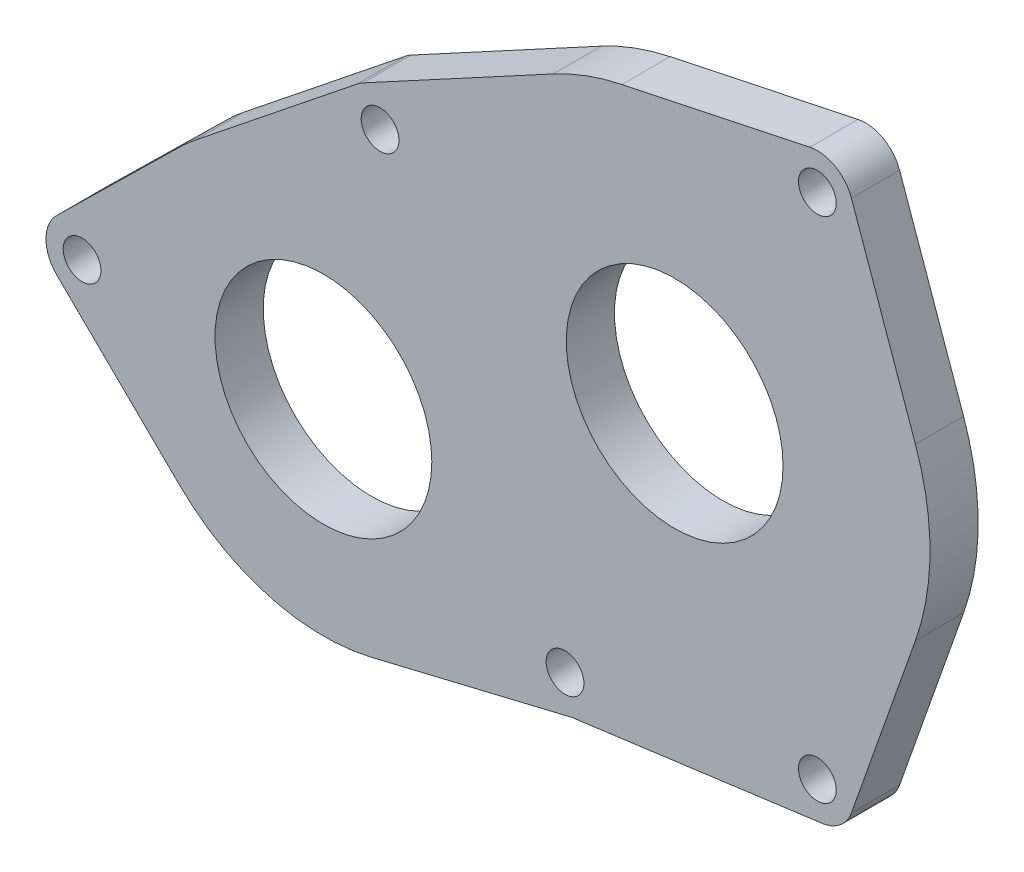
ISO-10303-21;
HEADER;
FILE_DESCRIPTION(('STEP AP214'),'2;1');
FILE_NAME('part.step','',(''),(''),'','','');
FILE_SCHEMA(('AUTOMOTIVE_DESIGN { 1 0 10303 214 1 1 1 1 }'));
ENDSEC;
DATA;
#1=APPLICATION_CONTEXT('core data for automotive mechanical design processes');
#2=APPLICATION_PROTOCOL_DEFINITION('international standard','automotive_design',2000,#1);
#3=PRODUCT_CONTEXT('',#1,'mechanical');
#4=PRODUCT('Part','Part','',(#3));
#5=PRODUCT_RELATED_PRODUCT_CATEGORY('part','',(#4));
#6=PRODUCT_DEFINITION_FORMATION('','',#4);
#7=PRODUCT_DEFINITION_CONTEXT('part definition',#1,'design');
#8=PRODUCT_DEFINITION('design','',#6,#7);
#9=PRODUCT_DEFINITION_SHAPE('','',#8);
#10=(LENGTH_UNIT() NAMED_UNIT(*) SI_UNIT(.MILLI.,.METRE.));
#11=(NAMED_UNIT(*) PLANE_ANGLE_UNIT() SI_UNIT($,.RADIAN.));
#12=(NAMED_UNIT(*) SI_UNIT($,.STERADIAN.) SOLID_ANGLE_UNIT());
#13=UNCERTAINTY_MEASURE_WITH_UNIT(LENGTH_MEASURE(1.E-05),#10,'distance_accuracy_value','');
#14=(GEOMETRIC_REPRESENTATION_CONTEXT(3) GLOBAL_UNCERTAINTY_ASSIGNED_CONTEXT((#13)) GLOBAL_UNIT_ASSIGNED_CONTEXT((#10,
#11,#12)) REPRESENTATION_CONTEXT('',''));
#15=CARTESIAN_POINT('',(0.,0.,0.));
#16=DIRECTION('',(0.,0.,1.));
#17=DIRECTION('',(1.,0.,0.));
#18=AXIS2_PLACEMENT_3D('',#15,#16,#17);
#19=CARTESIAN_POINT('',(575.445699628818,147.606517102029,3.175));
#20=DIRECTION('',(0.,0.,-1.));
#21=DIRECTION('',(-1.,0.,0.));
#22=AXIS2_PLACEMENT_3D('',#19,#20,#21);
#23=CYLINDRICAL_SURFACE('',#22,4.76250000000001);
#24=CARTESIAN_POINT('',(575.445699628818,147.606517102029,-3.175));
#25=DIRECTION('',(0.,0.,1.));
#26=DIRECTION('',(1.,0.,0.));
#27=AXIS2_PLACEMENT_3D('',#24,#25,#26);
#28=CIRCLE('',#27,4.76250000000001);
#29=CARTESIAN_POINT('',(576.075713373775,142.885872132201,-3.175));
#30=VERTEX_POINT('',#29);
#31=CARTESIAN_POINT('',(579.936262069107,146.02024624878,-3.175));
#32=VERTEX_POINT('',#31);
#33=EDGE_CURVE('E212',#30,#32,#28,.T.);
#34=ORIENTED_EDGE('',*,*,#33,.T.);
#35=DIRECTION('',(0.,0.,-1.));
#36=VECTOR('',#35,1.);
#37=CARTESIAN_POINT('',(579.936262069107,146.02024624878,3.175));
#38=LINE('',#37,#36);
#39=CARTESIAN_POINT('',(579.936262069107,146.02024624878,3.175));
#40=VERTEX_POINT('',#39);
#41=EDGE_CURVE('E11',#40,#32,#38,.T.);
#42=ORIENTED_EDGE('',*,*,#41,.F.);
#43=CARTESIAN_POINT('',(575.445699628818,147.606517102029,3.175));
#44=DIRECTION('',(0.,0.,1.));
#45=DIRECTION('',(1.,0.,0.));
#46=AXIS2_PLACEMENT_3D('',#43,#44,#45);
#47=CIRCLE('',#46,4.76250000000001);
#48=CARTESIAN_POINT('',(576.075713373775,142.885872132201,3.175));
#49=VERTEX_POINT('',#48);
#50=EDGE_CURVE('E122',#49,#40,#47,.T.);
#51=ORIENTED_EDGE('',*,*,#50,.F.);
#52=DIRECTION('',(0.,0.,-1.));
#53=VECTOR('',#52,1.);
#54=CARTESIAN_POINT('',(576.075713373775,142.885872132201,3.175));
#55=LINE('',#54,#53);
#56=EDGE_CURVE('E211',#49,#30,#55,.T.);
#57=ORIENTED_EDGE('',*,*,#56,.T.);
#58=EDGE_LOOP('',(#34,#42,#51,#57));
#59=FACE_BOUND('',#58,.T.);
#60=ADVANCED_FACE('F39',(#59),#23,.T.);
#61=CARTESIAN_POINT('',(469.740002986534,-165.933529541236,3.175));
#62=DIRECTION('',(0.94290024992944,-0.33307524477661,0.));
#63=DIRECTION('',(0.33307524477661,0.942900249929441,0.));
#64=AXIS2_PLACEMENT_3D('',#61,#62,#63);
#65=PLANE('',#64);
#66=DIRECTION('',(-0.33307524477661,-0.942900249929441,0.));
#67=VECTOR('',#66,1.);
#68=CARTESIAN_POINT('',(469.740002986534,-165.933529541236,-3.175));
#69=LINE('',#68,#67);
#70=CARTESIAN_POINT('',(588.369894000145,169.894952581043,-3.175));
#71=VERTEX_POINT('',#70);
#72=EDGE_CURVE('E215',#71,#32,#69,.T.);
#73=ORIENTED_EDGE('',*,*,#72,.F.);
#74=DIRECTION('',(0.,0.,-1.));
#75=VECTOR('',#74,1.);
#76=CARTESIAN_POINT('',(588.369894000145,169.894952581043,3.175));
#77=LINE('',#76,#75);
#78=CARTESIAN_POINT('',(588.369894000145,169.894952581043,3.175));
#79=VERTEX_POINT('',#78);
#80=EDGE_CURVE('E47',#79,#71,#77,.T.);
#81=ORIENTED_EDGE('',*,*,#80,.F.);
#82=DIRECTION('',(-0.33307524477661,-0.942900249929441,0.));
#83=VECTOR('',#82,1.);
#84=CARTESIAN_POINT('',(469.740002986534,-165.933529541236,3.175));
#85=LINE('',#84,#83);
#86=EDGE_CURVE('E314',#79,#40,#85,.T.);
#87=ORIENTED_EDGE('',*,*,#86,.T.);
#88=ORIENTED_EDGE('',*,*,#41,.T.);
#89=EDGE_LOOP('',(#73,#81,#87,#88));
#90=FACE_BOUND('',#89,.T.);
#91=ADVANCED_FACE('F313',(#90),#65,.T.);
#92=CARTESIAN_POINT('',(556.636586088769,181.104599944,3.175));
#93=DIRECTION('',(0.,0.,-1.));
#94=DIRECTION('',(-1.,0.,0.));
#95=AXIS2_PLACEMENT_3D('',#92,#93,#94);
#96=CYLINDRICAL_SURFACE('',#95,33.655);
#97=CARTESIAN_POINT('',(556.636586088769,181.104599944,-3.175));
#98=DIRECTION('',(0.,0.,1.));
#99=DIRECTION('',(1.,0.,0.));
#100=AXIS2_PLACEMENT_3D('',#97,#98,#99);
#101=CIRCLE('',#100,33.655);
#102=CARTESIAN_POINT('',(588.369894000145,192.314247306957,-3.175));
#103=VERTEX_POINT('',#102);
#104=EDGE_CURVE('E218',#71,#103,#101,.T.);
#105=ORIENTED_EDGE('',*,*,#104,.T.);
#106=DIRECTION('',(0.,0.,-1.));
#107=VECTOR('',#106,1.);
#108=CARTESIAN_POINT('',(588.369894000145,192.314247306957,3.175));
#109=LINE('',#108,#107);
#110=CARTESIAN_POINT('',(588.369894000145,192.314247306957,3.175));
#111=VERTEX_POINT('',#110);
#112=EDGE_CURVE('E297',#111,#103,#109,.T.);
#113=ORIENTED_EDGE('',*,*,#112,.F.);
#114=CARTESIAN_POINT('',(556.636586088769,181.104599944,3.175));
#115=DIRECTION('',(0.,0.,1.));
#116=DIRECTION('',(1.,0.,0.));
#117=AXIS2_PLACEMENT_3D('',#114,#115,#116);
#118=CIRCLE('',#117,33.655);
#119=EDGE_CURVE('E303',#79,#111,#118,.T.);
#120=ORIENTED_EDGE('',*,*,#119,.F.);
#121=ORIENTED_EDGE('',*,*,#80,.T.);
#122=EDGE_LOOP('',(#105,#113,#120,#121));
#123=FACE_BOUND('',#122,.T.);
#124=ADVANCED_FACE('F301',(#123),#96,.T.);
#125=CARTESIAN_POINT('',(583.494240438953,206.116698955685,3.175));
#126=DIRECTION('',(0.94290024992944,0.33307524477661,0.));
#127=DIRECTION('',(-0.33307524477661,0.94290024992944,0.));
#128=AXIS2_PLACEMENT_3D('',#125,#126,#127);
#129=PLANE('',#128);
#130=DIRECTION('',(0.33307524477661,-0.94290024992944,0.));
#131=VECTOR('',#130,1.);
#132=CARTESIAN_POINT('',(583.494240438953,206.116698955685,-3.175));
#133=LINE('',#132,#131);
#134=CARTESIAN_POINT('',(579.936262069107,216.18895363922,-3.175));
#135=VERTEX_POINT('',#134);
#136=EDGE_CURVE('E221',#135,#103,#133,.T.);
#137=ORIENTED_EDGE('',*,*,#136,.F.);
#138=DIRECTION('',(0.,0.,-1.));
#139=VECTOR('',#138,1.);
#140=CARTESIAN_POINT('',(579.936262069107,216.18895363922,3.175));
#141=LINE('',#140,#139);
#142=CARTESIAN_POINT('',(579.936262069107,216.18895363922,3.175));
#143=VERTEX_POINT('',#142);
#144=EDGE_CURVE('E295',#143,#135,#141,.T.);
#145=ORIENTED_EDGE('',*,*,#144,.F.);
#146=DIRECTION('',(0.33307524477661,-0.94290024992944,0.));
#147=VECTOR('',#146,1.);
#148=CARTESIAN_POINT('',(583.494240438953,206.116698955685,3.175));
#149=LINE('',#148,#147);
#150=EDGE_CURVE('E374',#143,#111,#149,.T.);
#151=ORIENTED_EDGE('',*,*,#150,.T.);
#152=ORIENTED_EDGE('',*,*,#112,.T.);
#153=EDGE_LOOP('',(#137,#145,#151,#152));
#154=FACE_BOUND('',#153,.T.);
#155=ADVANCED_FACE('F371',(#154),#129,.T.);
#156=CARTESIAN_POINT('',(575.445699628818,214.602682785971,3.175));
#157=DIRECTION('',(0.,0.,-1.));
#158=DIRECTION('',(-1.,0.,0.));
#159=AXIS2_PLACEMENT_3D('',#156,#157,#158);
#160=CYLINDRICAL_SURFACE('',#159,4.76250000000001);
#161=CARTESIAN_POINT('',(575.445699628818,214.602682785971,-3.175));
#162=DIRECTION('',(0.,0.,1.));
#163=DIRECTION('',(1.,0.,0.));
#164=AXIS2_PLACEMENT_3D('',#161,#162,#163);
#165=CIRCLE('',#164,4.76250000000001);
#166=CARTESIAN_POINT('',(574.462334781886,219.262554010352,-3.175));
#167=VERTEX_POINT('',#166);
#168=EDGE_CURVE('E225',#135,#167,#165,.T.);
#169=ORIENTED_EDGE('',*,*,#168,.T.);
#170=DIRECTION('',(0.,0.,-1.));
#171=VECTOR('',#170,1.);
#172=CARTESIAN_POINT('',(574.462334781886,219.262554010352,3.175));
#173=LINE('',#172,#171);
#174=CARTESIAN_POINT('',(574.462334781886,219.262554010352,3.175));
#175=VERTEX_POINT('',#174);
#176=EDGE_CURVE('E293',#175,#167,#173,.T.);
#177=ORIENTED_EDGE('',*,*,#176,.F.);
#178=CARTESIAN_POINT('',(575.445699628818,214.602682785971,3.175));
#179=DIRECTION('',(0.,0.,1.));
#180=DIRECTION('',(1.,0.,0.));
#181=AXIS2_PLACEMENT_3D('',#178,#179,#180);
#182=CIRCLE('',#181,4.76250000000001);
#183=EDGE_CURVE('E375',#143,#175,#182,.T.);
#184=ORIENTED_EDGE('',*,*,#183,.F.);
#185=ORIENTED_EDGE('',*,*,#144,.T.);
#186=EDGE_LOOP('',(#169,#177,#184,#185));
#187=FACE_BOUND('',#186,.T.);
#188=ADVANCED_FACE('F369',(#187),#160,.T.);
#189=CARTESIAN_POINT('',(-19.806081311051,93.8550820247804,3.175));
#190=DIRECTION('',(-0.206480807754831,0.978450650788742,0.));
#191=DIRECTION('',(-0.978450650788742,-0.206480807754831,0.));
#192=AXIS2_PLACEMENT_3D('',#189,#190,#191);
#193=PLANE('',#192);
#194=DIRECTION('',(0.978450650788742,0.206480807754831,0.));
#195=VECTOR('',#194,1.);
#196=CARTESIAN_POINT('',(-19.806081311051,93.8550820247804,-3.175));
#197=LINE('',#196,#195);
#198=CARTESIAN_POINT('',(549.687474503781,214.034356596295,-3.175));
#199=VERTEX_POINT('',#198);
#200=EDGE_CURVE('E228',#199,#167,#197,.T.);
#201=ORIENTED_EDGE('',*,*,#200,.F.);
#202=DIRECTION('',(0.,0.,-1.));
#203=VECTOR('',#202,1.);
#204=CARTESIAN_POINT('',(549.687474503781,214.034356596295,3.175));
#205=LINE('',#204,#203);
#206=CARTESIAN_POINT('',(549.687474503781,214.034356596295,3.175));
#207=VERTEX_POINT('',#206);
#208=EDGE_CURVE('E291',#207,#199,#205,.T.);
#209=ORIENTED_EDGE('',*,*,#208,.F.);
#210=DIRECTION('',(0.978450650788742,0.206480807754831,0.));
#211=VECTOR('',#210,1.);
#212=CARTESIAN_POINT('',(-19.806081311051,93.8550820247804,3.175));
#213=LINE('',#212,#211);
#214=EDGE_CURVE('E366',#207,#175,#213,.T.);
#215=ORIENTED_EDGE('',*,*,#214,.T.);
#216=ORIENTED_EDGE('',*,*,#176,.T.);
#217=EDGE_LOOP('',(#201,#209,#215,#216));
#218=FACE_BOUND('',#217,.T.);
#219=ADVANCED_FACE('F362',(#218),#193,.T.);
#220=CARTESIAN_POINT('',(540.628438151175,210.708623734831,-3.175));
#221=VERTEX_POINT('',#220);
#222=EDGE_CURVE('E222',#199,#221,#101,.T.);
#223=ORIENTED_EDGE('',*,*,#222,.T.);
#224=DIRECTION('',(0.,0.,-1.));
#225=VECTOR('',#224,1.);
#226=CARTESIAN_POINT('',(540.628438151175,210.708623734831,3.175));
#227=LINE('',#226,#225);
#228=CARTESIAN_POINT('',(540.628438151175,210.708623734831,3.175));
#229=VERTEX_POINT('',#228);
#230=EDGE_CURVE('E289',#229,#221,#227,.T.);
#231=ORIENTED_EDGE('',*,*,#230,.F.);
#232=EDGE_CURVE('E379',#207,#229,#118,.T.);
#233=ORIENTED_EDGE('',*,*,#232,.F.);
#234=ORIENTED_EDGE('',*,*,#208,.T.);
#235=EDGE_LOOP('',(#223,#231,#233,#234));
#236=FACE_BOUND('',#235,.T.);
#237=ADVANCED_FACE('F359',(#236),#96,.T.);
#238=CARTESIAN_POINT('',(34.1549224155533,-63.1630304583503,3.175));
#239=DIRECTION('',(-0.475654373424279,0.879632262392846,0.));
#240=DIRECTION('',(-0.879632262392846,-0.47565437342428,0.));
#241=AXIS2_PLACEMENT_3D('',#238,#239,#240);
#242=PLANE('',#241);
#243=DIRECTION('',(0.879632262392846,0.475654373424279,0.));
#244=VECTOR('',#243,1.);
#245=CARTESIAN_POINT('',(34.1549224155533,-63.1630304583503,-3.175));
#246=LINE('',#245,#244);
#247=CARTESIAN_POINT('',(515.540757388625,197.142653517552,-3.175));
#248=VERTEX_POINT('',#247);
#249=EDGE_CURVE('E231',#248,#221,#246,.T.);
#250=ORIENTED_EDGE('',*,*,#249,.F.);
#251=DIRECTION('',(0.,0.,-1.));
#252=VECTOR('',#251,1.);
#253=CARTESIAN_POINT('',(515.540757388625,197.142653517552,3.175));
#254=LINE('',#253,#252);
#255=CARTESIAN_POINT('',(515.540757388625,197.142653517552,3.175));
#256=VERTEX_POINT('',#255);
#257=EDGE_CURVE('E287',#256,#248,#254,.T.);
#258=ORIENTED_EDGE('',*,*,#257,.F.);
#259=DIRECTION('',(0.879632262392846,0.475654373424279,0.));
#260=VECTOR('',#259,1.);
#261=CARTESIAN_POINT('',(34.1549224155533,-63.1630304583503,3.175));
#262=LINE('',#261,#260);
#263=EDGE_CURVE('E356',#256,#229,#262,.T.);
#264=ORIENTED_EDGE('',*,*,#263,.T.);
#265=ORIENTED_EDGE('',*,*,#230,.T.);
#266=EDGE_LOOP('',(#250,#258,#264,#265));
#267=FACE_BOUND('',#266,.T.);
#268=ADVANCED_FACE('F352',(#267),#242,.T.);
#269=CARTESIAN_POINT('',(517.806061342058,192.953404867906,3.175));
#270=DIRECTION('',(0.,0.,-1.));
#271=DIRECTION('',(-1.,0.,0.));
#272=AXIS2_PLACEMENT_3D('',#269,#270,#271);
#273=CYLINDRICAL_SURFACE('',#272,4.76250000000002);
#274=CARTESIAN_POINT('',(517.806061342058,192.953404867906,-3.175));
#275=DIRECTION('',(0.,0.,1.));
#276=DIRECTION('',(1.,0.,0.));
#277=AXIS2_PLACEMENT_3D('',#274,#275,#276);
#278=CIRCLE('',#277,4.76250000000002);
#279=CARTESIAN_POINT('',(514.830672239489,196.672069404848,-3.175));
#280=VERTEX_POINT('',#279);
#281=EDGE_CURVE('E234',#248,#280,#278,.T.);
#282=ORIENTED_EDGE('',*,*,#281,.T.);
#283=DIRECTION('',(0.,0.,-1.));
#284=VECTOR('',#283,1.);
#285=CARTESIAN_POINT('',(514.830672239489,196.672069404848,3.175));
#286=LINE('',#285,#284);
#287=CARTESIAN_POINT('',(514.830672239489,196.672069404848,3.175));
#288=VERTEX_POINT('',#287);
#289=EDGE_CURVE('E284',#288,#280,#286,.T.);
#290=ORIENTED_EDGE('',*,*,#289,.F.);
#291=CARTESIAN_POINT('',(517.806061342058,192.953404867906,3.175));
#292=DIRECTION('',(0.,0.,1.));
#293=DIRECTION('',(1.,0.,0.));
#294=AXIS2_PLACEMENT_3D('',#291,#292,#293);
#295=CIRCLE('',#294,4.76250000000002);
#296=EDGE_CURVE('E347',#256,#288,#295,.T.);
#297=ORIENTED_EDGE('',*,*,#296,.F.);
#298=ORIENTED_EDGE('',*,*,#257,.T.);
#299=EDGE_LOOP('',(#282,#290,#297,#298));
#300=FACE_BOUND('',#299,.T.);
#301=ADVANCED_FACE('F346',(#300),#273,.T.);
#302=CARTESIAN_POINT('',(105.006373907612,-131.237786165849,3.175));
#303=DIRECTION('',(0.624753617337332,-0.780821950014162,0.));
#304=DIRECTION('',(0.780821950014162,0.624753617337332,0.));
#305=AXIS2_PLACEMENT_3D('',#302,#303,#304);
#306=PLANE('',#305);
#307=DIRECTION('',(-0.780821950014162,-0.624753617337332,0.));
#308=VECTOR('',#307,1.);
#309=CARTESIAN_POINT('',(105.006373907612,-131.237786165849,-3.175));
#310=LINE('',#309,#308);
#311=CARTESIAN_POINT('',(493.439885763083,179.556808712468,-3.175));
#312=VERTEX_POINT('',#311);
#313=EDGE_CURVE('E236',#280,#312,#310,.T.);
#314=ORIENTED_EDGE('',*,*,#313,.T.);
#315=DIRECTION('',(0.,0.,-1.));
#316=VECTOR('',#315,1.);
#317=CARTESIAN_POINT('',(493.439885763083,179.556808712468,3.175));
#318=LINE('',#317,#316);
#319=CARTESIAN_POINT('',(493.439885763083,179.556808712468,3.175));
#320=VERTEX_POINT('',#319);
#321=EDGE_CURVE('E281',#320,#312,#318,.T.);
#322=ORIENTED_EDGE('',*,*,#321,.F.);
#323=DIRECTION('',(-0.780821950014162,-0.624753617337332,0.));
#324=VECTOR('',#323,1.);
#325=CARTESIAN_POINT('',(105.006373907612,-131.237786165849,3.175));
#326=LINE('',#325,#324);
#327=EDGE_CURVE('E342',#288,#320,#326,.T.);
#328=ORIENTED_EDGE('',*,*,#327,.F.);
#329=ORIENTED_EDGE('',*,*,#289,.T.);
#330=EDGE_LOOP('',(#314,#322,#328,#329));
#331=FACE_BOUND('',#330,.T.);
#332=ADVANCED_FACE('F341',(#331),#306,.F.);
#333=CARTESIAN_POINT('',(510.338372179796,158.436948418708,3.175));
#334=DIRECTION('',(0.,0.,-1.));
#335=DIRECTION('',(-1.,0.,0.));
#336=AXIS2_PLACEMENT_3D('',#333,#334,#335);
#337=CYLINDRICAL_SURFACE('',#336,27.0482410149674);
#338=CARTESIAN_POINT('',(510.338372179796,158.436948418708,-3.175));
#339=DIRECTION('',(0.,0.,1.));
#340=DIRECTION('',(1.,0.,0.));
#341=AXIS2_PLACEMENT_3D('',#338,#339,#340);
#342=CIRCLE('',#341,27.0482410149674);
#343=CARTESIAN_POINT('',(491.389109291315,177.738056624897,-3.175));
#344=VERTEX_POINT('',#343);
#345=EDGE_CURVE('E238',#312,#344,#342,.T.);
#346=ORIENTED_EDGE('',*,*,#345,.T.);
#347=DIRECTION('',(0.,0.,-1.));
#348=VECTOR('',#347,1.);
#349=CARTESIAN_POINT('',(491.389109291315,177.738056624897,3.175));
#350=LINE('',#349,#348);
#351=CARTESIAN_POINT('',(491.389109291315,177.738056624897,3.175));
#352=VERTEX_POINT('',#351);
#353=EDGE_CURVE('E278',#352,#344,#350,.T.);
#354=ORIENTED_EDGE('',*,*,#353,.F.);
#355=CARTESIAN_POINT('',(510.338372179796,158.436948418708,3.175));
#356=DIRECTION('',(0.,0.,1.));
#357=DIRECTION('',(1.,0.,0.));
#358=AXIS2_PLACEMENT_3D('',#355,#356,#357);
#359=CIRCLE('',#358,27.0482410149674);
#360=EDGE_CURVE('E176',#320,#352,#359,.T.);
#361=ORIENTED_EDGE('',*,*,#360,.F.);
#362=ORIENTED_EDGE('',*,*,#321,.T.);
#363=EDGE_LOOP('',(#346,#354,#361,#362));
#364=FACE_BOUND('',#363,.T.);
#365=ADVANCED_FACE('F336',(#364),#337,.T.);
#366=CARTESIAN_POINT('',(152.320912798262,-155.149170565998,3.175));
#367=DIRECTION('',(0.700572834957904,-0.713580901453399,0.));
#368=DIRECTION('',(0.713580901453399,0.700572834957904,0.));
#369=AXIS2_PLACEMENT_3D('',#366,#367,#368);
#370=PLANE('',#369);
#371=DIRECTION('',(-0.713580901453399,-0.700572834957904,0.));
#372=VECTOR('',#371,1.);
#373=CARTESIAN_POINT('',(152.320912798262,-155.149170565998,-3.175));
#374=LINE('',#373,#372);
#375=CARTESIAN_POINT('',(475.191153038341,161.83537746188,-3.175));
#376=VERTEX_POINT('',#375);
#377=EDGE_CURVE('E240',#344,#376,#374,.T.);
#378=ORIENTED_EDGE('',*,*,#377,.T.);
#379=DIRECTION('',(0.,0.,-1.));
#380=VECTOR('',#379,1.);
#381=CARTESIAN_POINT('',(475.191153038341,161.83537746188,3.175));
#382=LINE('',#381,#380);
#383=CARTESIAN_POINT('',(475.191153038341,161.83537746188,3.175));
#384=VERTEX_POINT('',#383);
#385=EDGE_CURVE('E275',#384,#376,#382,.T.);
#386=ORIENTED_EDGE('',*,*,#385,.F.);
#387=DIRECTION('',(-0.713580901453399,-0.700572834957904,0.));
#388=VECTOR('',#387,1.);
#389=CARTESIAN_POINT('',(152.320912798262,-155.149170565998,3.175));
#390=LINE('',#389,#388);
#391=EDGE_CURVE('E330',#352,#384,#390,.T.);
#392=ORIENTED_EDGE('',*,*,#391,.F.);
#393=ORIENTED_EDGE('',*,*,#353,.T.);
#394=EDGE_LOOP('',(#378,#386,#392,#393));
#395=FACE_BOUND('',#394,.T.);
#396=ADVANCED_FACE('F329',(#395),#370,.F.);
#397=CARTESIAN_POINT('',(478.527631164828,158.436948418708,3.175));
#398=DIRECTION('',(0.,0.,-1.));
#399=DIRECTION('',(-1.,0.,0.));
#400=AXIS2_PLACEMENT_3D('',#397,#398,#399);
#401=CYLINDRICAL_SURFACE('',#400,4.76250000000001);
#402=CARTESIAN_POINT('',(478.527631164828,158.436948418708,-3.175));
#403=DIRECTION('',(0.,0.,1.));
#404=DIRECTION('',(1.,0.,0.));
#405=AXIS2_PLACEMENT_3D('',#402,#403,#404);
#406=CIRCLE('',#405,4.76250000000001);
#407=CARTESIAN_POINT('',(475.191153038341,155.038519375536,-3.175));
#408=VERTEX_POINT('',#407);
#409=EDGE_CURVE('E242',#376,#408,#406,.T.);
#410=ORIENTED_EDGE('',*,*,#409,.T.);
#411=DIRECTION('',(0.,0.,-1.));
#412=VECTOR('',#411,1.);
#413=CARTESIAN_POINT('',(475.191153038341,155.038519375536,3.175));
#414=LINE('',#413,#412);
#415=CARTESIAN_POINT('',(475.191153038341,155.038519375536,3.175));
#416=VERTEX_POINT('',#415);
#417=EDGE_CURVE('E272',#416,#408,#414,.T.);
#418=ORIENTED_EDGE('',*,*,#417,.F.);
#419=CARTESIAN_POINT('',(478.527631164828,158.436948418708,3.175));
#420=DIRECTION('',(0.,0.,1.));
#421=DIRECTION('',(1.,0.,0.));
#422=AXIS2_PLACEMENT_3D('',#419,#420,#421);
#423=CIRCLE('',#422,4.76250000000001);
#424=EDGE_CURVE('E325',#384,#416,#423,.T.);
#425=ORIENTED_EDGE('',*,*,#424,.F.);
#426=ORIENTED_EDGE('',*,*,#385,.T.);
#427=EDGE_LOOP('',(#410,#418,#425,#426));
#428=FACE_BOUND('',#427,.T.);
#429=ADVANCED_FACE('F324',(#428),#401,.T.);
#430=CARTESIAN_POINT('',(310.731052133575,316.500630950617,3.175));
#431=DIRECTION('',(0.700572834957905,0.713580901453398,0.));
#432=DIRECTION('',(-0.713580901453398,0.700572834957905,0.));
#433=AXIS2_PLACEMENT_3D('',#430,#431,#432);
#434=PLANE('',#433);
#435=DIRECTION('',(0.713580901453398,-0.700572834957905,0.));
#436=VECTOR('',#435,1.);
#437=CARTESIAN_POINT('',(310.731052133575,316.500630950617,-3.175));
#438=LINE('',#437,#436);
#439=CARTESIAN_POINT('',(491.389109291315,139.135840212519,-3.175));
#440=VERTEX_POINT('',#439);
#441=EDGE_CURVE('E244',#408,#440,#438,.T.);
#442=ORIENTED_EDGE('',*,*,#441,.T.);
#443=DIRECTION('',(0.,0.,-1.));
#444=VECTOR('',#443,1.);
#445=CARTESIAN_POINT('',(491.389109291315,139.135840212519,3.175));
#446=LINE('',#445,#444);
#447=CARTESIAN_POINT('',(491.389109291315,139.135840212519,3.175));
#448=VERTEX_POINT('',#447);
#449=EDGE_CURVE('E181',#448,#440,#446,.T.);
#450=ORIENTED_EDGE('',*,*,#449,.F.);
#451=DIRECTION('',(0.713580901453398,-0.700572834957905,0.));
#452=VECTOR('',#451,1.);
#453=CARTESIAN_POINT('',(310.731052133575,316.500630950617,3.175));
#454=LINE('',#453,#452);
#455=EDGE_CURVE('E171',#416,#448,#454,.T.);
#456=ORIENTED_EDGE('',*,*,#455,.F.);
#457=ORIENTED_EDGE('',*,*,#417,.T.);
#458=EDGE_LOOP('',(#442,#450,#456,#457));
#459=FACE_BOUND('',#458,.T.);
#460=ADVANCED_FACE('F320',(#459),#434,.F.);
#461=CARTESIAN_POINT('',(516.656664159551,132.137014417606,-3.175));
#462=VERTEX_POINT('',#461);
#463=EDGE_CURVE('E180',#440,#462,#342,.T.);
#464=ORIENTED_EDGE('',*,*,#463,.T.);
#465=DIRECTION('',(0.,0.,-1.));
#466=VECTOR('',#465,1.);
#467=CARTESIAN_POINT('',(516.656664159551,132.137014417606,3.175));
#468=LINE('',#467,#466);
#469=CARTESIAN_POINT('',(516.656664159551,132.137014417606,3.175));
#470=VERTEX_POINT('',#469);
#471=EDGE_CURVE('E177',#470,#462,#468,.T.);
#472=ORIENTED_EDGE('',*,*,#471,.F.);
#473=EDGE_CURVE('E164',#448,#470,#359,.T.);
#474=ORIENTED_EDGE('',*,*,#473,.F.);
#475=ORIENTED_EDGE('',*,*,#449,.T.);
#476=EDGE_LOOP('',(#464,#472,#474,#475));
#477=FACE_BOUND('',#476,.T.);
#478=ADVANCED_FACE('F178',(#477),#337,.T.);
#479=CARTESIAN_POINT('',(-1.82056786207055,7.57812629906884,3.175));
#480=DIRECTION('',(-0.233593451650311,0.972334355736798,0.));
#481=DIRECTION('',(-0.972334355736798,-0.233593451650311,0.));
#482=AXIS2_PLACEMENT_3D('',#479,#480,#481);
#483=PLANE('',#482);
#484=DIRECTION('',(0.972334355736798,0.233593451650311,0.));
#485=VECTOR('',#484,1.);
#486=CARTESIAN_POINT('',(-1.82056786207055,7.57812629906884,-3.175));
#487=LINE('',#486,#485);
#488=CARTESIAN_POINT('',(543.055056160763,138.478959931717,-3.175));
#489=VERTEX_POINT('',#488);
#490=EDGE_CURVE('E110',#462,#489,#487,.T.);
#491=ORIENTED_EDGE('',*,*,#490,.T.);
#492=DIRECTION('',(0.,0.,-1.));
#493=VECTOR('',#492,1.);
#494=CARTESIAN_POINT('',(543.055056160763,138.478959931717,3.175));
#495=LINE('',#494,#493);
#496=CARTESIAN_POINT('',(543.055056160763,138.478959931717,3.175));
#497=VERTEX_POINT('',#496);
#498=EDGE_CURVE('E182',#497,#489,#495,.T.);
#499=ORIENTED_EDGE('',*,*,#498,.F.);
#500=DIRECTION('',(0.972334355736798,0.233593451650311,0.));
#501=VECTOR('',#500,1.);
#502=CARTESIAN_POINT('',(-1.82056786207055,7.57812629906884,3.175));
#503=LINE('',#502,#501);
#504=EDGE_CURVE('E169',#470,#497,#503,.T.);
#505=ORIENTED_EDGE('',*,*,#504,.F.);
#506=ORIENTED_EDGE('',*,*,#471,.T.);
#507=EDGE_LOOP('',(#491,#499,#505,#506));
#508=FACE_BOUND('',#507,.T.);
#509=ADVANCED_FACE('F184',(#508),#483,.F.);
#510=CARTESIAN_POINT('',(542.181485666124,143.1671,3.175));
#511=DIRECTION('',(0.,0.,-1.));
#512=DIRECTION('',(-1.,0.,0.));
#513=AXIS2_PLACEMENT_3D('',#510,#511,#512);
#514=CYLINDRICAL_SURFACE('',#513,2.48920000000017);
#515=CARTESIAN_POINT('',(542.181485666124,143.1671,3.175));
#516=DIRECTION('',(0.,0.,1.));
#517=DIRECTION('',(1.,0.,0.));
#518=AXIS2_PLACEMENT_3D('',#515,#516,#517);
#519=CIRCLE('',#518,2.48920000000017);
#520=CARTESIAN_POINT('',(544.670685666125,143.1671,3.175));
#521=VERTEX_POINT('',#520);
#522=EDGE_CURVE('E205',#521,#521,#519,.T.);
#523=ORIENTED_EDGE('',*,*,#522,.T.);
#524=EDGE_LOOP('',(#523));
#525=FACE_BOUND('',#524,.T.);
#526=CARTESIAN_POINT('',(542.181485666124,143.1671,-3.175));
#527=DIRECTION('',(0.,0.,1.));
#528=DIRECTION('',(1.,0.,0.));
#529=AXIS2_PLACEMENT_3D('',#526,#527,#528);
#530=CIRCLE('',#529,2.48920000000017);
#531=CARTESIAN_POINT('',(544.670685666125,143.1671,-3.175));
#532=VERTEX_POINT('',#531);
#533=EDGE_CURVE('E263',#532,#532,#530,.T.);
#534=ORIENTED_EDGE('',*,*,#533,.F.);
#535=EDGE_LOOP('',(#534));
#536=FACE_BOUND('',#535,.T.);
#537=ADVANCED_FACE('F515',(#525,#536),#514,.F.);
#538=CARTESIAN_POINT('',(575.445699628818,147.606517102029,3.175));
#539=DIRECTION('',(0.,0.,-1.));
#540=DIRECTION('',(-1.,0.,0.));
#541=AXIS2_PLACEMENT_3D('',#538,#539,#540);
#542=CYLINDRICAL_SURFACE('',#541,2.48919999999995);
#543=CARTESIAN_POINT('',(575.445699628818,147.606517102029,3.175));
#544=DIRECTION('',(0.,0.,1.));
#545=DIRECTION('',(1.,0.,0.));
#546=AXIS2_PLACEMENT_3D('',#543,#544,#545);
#547=CIRCLE('',#546,2.48919999999995);
#548=CARTESIAN_POINT('',(577.934899628818,147.606517102029,3.175));
#549=VERTEX_POINT('',#548);
#550=EDGE_CURVE('E202',#549,#549,#547,.T.);
#551=ORIENTED_EDGE('',*,*,#550,.T.);
#552=EDGE_LOOP('',(#551));
#553=FACE_BOUND('',#552,.T.);
#554=CARTESIAN_POINT('',(575.445699628818,147.606517102029,-3.175));
#555=DIRECTION('',(0.,0.,1.));
#556=DIRECTION('',(1.,0.,0.));
#557=AXIS2_PLACEMENT_3D('',#554,#555,#556);
#558=CIRCLE('',#557,2.48919999999995);
#559=CARTESIAN_POINT('',(577.934899628818,147.606517102029,-3.175));
#560=VERTEX_POINT('',#559);
#561=EDGE_CURVE('E260',#560,#560,#558,.T.);
#562=ORIENTED_EDGE('',*,*,#561,.F.);
#563=EDGE_LOOP('',(#562));
#564=FACE_BOUND('',#563,.T.);
#565=ADVANCED_FACE('F525',(#553,#564),#542,.F.);
#566=CARTESIAN_POINT('',(478.527631164828,158.436948418708,3.175));
#567=DIRECTION('',(0.,0.,-1.));
#568=DIRECTION('',(-1.,0.,0.));
#569=AXIS2_PLACEMENT_3D('',#566,#567,#568);
#570=CYLINDRICAL_SURFACE('',#569,2.48920000000001);
#571=CARTESIAN_POINT('',(478.527631164828,158.436948418708,3.175));
#572=DIRECTION('',(0.,0.,1.));
#573=DIRECTION('',(1.,0.,0.));
#574=AXIS2_PLACEMENT_3D('',#571,#572,#573);
#575=CIRCLE('',#574,2.48920000000001);
#576=CARTESIAN_POINT('',(481.016831164828,158.436948418708,3.175));
#577=VERTEX_POINT('',#576);
#578=EDGE_CURVE('E199',#577,#577,#575,.T.);
#579=ORIENTED_EDGE('',*,*,#578,.T.);
#580=EDGE_LOOP('',(#579));
#581=FACE_BOUND('',#580,.T.);
#582=CARTESIAN_POINT('',(478.527631164828,158.436948418708,-3.175));
#583=DIRECTION('',(0.,0.,1.));
#584=DIRECTION('',(1.,0.,0.));
#585=AXIS2_PLACEMENT_3D('',#582,#583,#584);
#586=CIRCLE('',#585,2.48920000000001);
#587=CARTESIAN_POINT('',(481.016831164828,158.436948418708,-3.175));
#588=VERTEX_POINT('',#587);
#589=EDGE_CURVE('E257',#588,#588,#586,.T.);
#590=ORIENTED_EDGE('',*,*,#589,.F.);
#591=EDGE_LOOP('',(#590));
#592=FACE_BOUND('',#591,.T.);
#593=ADVANCED_FACE('F536',(#581,#592),#570,.F.);
#594=CARTESIAN_POINT('',(556.636586088769,181.104599944,3.175));
#595=DIRECTION('',(0.,0.,-1.));
#596=DIRECTION('',(-1.,0.,0.));
#597=AXIS2_PLACEMENT_3D('',#594,#595,#596);
#598=CYLINDRICAL_SURFACE('',#597,14.2875);
#599=CARTESIAN_POINT('',(556.636586088769,181.104599944,3.175));
#600=DIRECTION('',(0.,0.,1.));
#601=DIRECTION('',(1.,0.,0.));
#602=AXIS2_PLACEMENT_3D('',#599,#600,#601);
#603=CIRCLE('',#602,14.2875);
#604=CARTESIAN_POINT('',(570.92408608877,181.104599944,3.175));
#605=VERTEX_POINT('',#604);
#606=EDGE_CURVE('E196',#605,#605,#603,.T.);
#607=ORIENTED_EDGE('',*,*,#606,.T.);
#608=EDGE_LOOP('',(#607));
#609=FACE_BOUND('',#608,.T.);
#610=CARTESIAN_POINT('',(556.636586088769,181.104599944,-3.175));
#611=DIRECTION('',(0.,0.,1.));
#612=DIRECTION('',(1.,0.,0.));
#613=AXIS2_PLACEMENT_3D('',#610,#611,#612);
#614=CIRCLE('',#613,14.2875);
#615=CARTESIAN_POINT('',(570.92408608877,181.104599944,-3.175));
#616=VERTEX_POINT('',#615);
#617=EDGE_CURVE('E254',#616,#616,#614,.T.);
#618=ORIENTED_EDGE('',*,*,#617,.F.);
#619=EDGE_LOOP('',(#618));
#620=FACE_BOUND('',#619,.T.);
#621=ADVANCED_FACE('F547',(#609,#620),#598,.F.);
#622=CARTESIAN_POINT('',(517.806061342058,192.953404867906,3.175));
#623=DIRECTION('',(0.,0.,-1.));
#624=DIRECTION('',(-1.,0.,0.));
#625=AXIS2_PLACEMENT_3D('',#622,#623,#624);
#626=CYLINDRICAL_SURFACE('',#625,2.48919999999996);
#627=CARTESIAN_POINT('',(517.806061342058,192.953404867906,3.175));
#628=DIRECTION('',(0.,0.,1.));
#629=DIRECTION('',(1.,0.,0.));
#630=AXIS2_PLACEMENT_3D('',#627,#628,#629);
#631=CIRCLE('',#630,2.48919999999996);
#632=CARTESIAN_POINT('',(520.295261342058,192.953404867906,3.175));
#633=VERTEX_POINT('',#632);
#634=EDGE_CURVE('E193',#633,#633,#631,.T.);
#635=ORIENTED_EDGE('',*,*,#634,.T.);
#636=EDGE_LOOP('',(#635));
#637=FACE_BOUND('',#636,.T.);
#638=CARTESIAN_POINT('',(517.806061342058,192.953404867906,-3.175));
#639=DIRECTION('',(0.,0.,1.));
#640=DIRECTION('',(1.,0.,0.));
#641=AXIS2_PLACEMENT_3D('',#638,#639,#640);
#642=CIRCLE('',#641,2.48919999999996);
#643=CARTESIAN_POINT('',(520.295261342058,192.953404867906,-3.175));
#644=VERTEX_POINT('',#643);
#645=EDGE_CURVE('E251',#644,#644,#642,.T.);
#646=ORIENTED_EDGE('',*,*,#645,.F.);
#647=EDGE_LOOP('',(#646));
#648=FACE_BOUND('',#647,.T.);
#649=ADVANCED_FACE('F558',(#637,#648),#626,.F.);
#650=CARTESIAN_POINT('',(510.338372179796,158.436948418708,3.175));
#651=DIRECTION('',(0.,0.,-1.));
#652=DIRECTION('',(-1.,0.,0.));
#653=AXIS2_PLACEMENT_3D('',#650,#651,#652);
#654=CYLINDRICAL_SURFACE('',#653,14.2875);
#655=CARTESIAN_POINT('',(510.338372179796,158.436948418708,3.175));
#656=DIRECTION('',(0.,0.,1.));
#657=DIRECTION('',(1.,0.,0.));
#658=AXIS2_PLACEMENT_3D('',#655,#656,#657);
#659=CIRCLE('',#658,14.2875);
#660=CARTESIAN_POINT('',(524.625872179796,158.436948418708,3.175));
#661=VERTEX_POINT('',#660);
#662=EDGE_CURVE('E186',#661,#661,#659,.T.);
#663=ORIENTED_EDGE('',*,*,#662,.T.);
#664=EDGE_LOOP('',(#663));
#665=FACE_BOUND('',#664,.T.);
#666=CARTESIAN_POINT('',(510.338372179796,158.436948418708,-3.175));
#667=DIRECTION('',(0.,0.,1.));
#668=DIRECTION('',(1.,0.,0.));
#669=AXIS2_PLACEMENT_3D('',#666,#667,#668);
#670=CIRCLE('',#669,14.2875);
#671=CARTESIAN_POINT('',(524.625872179796,158.436948418708,-3.175));
#672=VERTEX_POINT('',#671);
#673=EDGE_CURVE('E248',#672,#672,#670,.T.);
#674=ORIENTED_EDGE('',*,*,#673,.F.);
#675=EDGE_LOOP('',(#674));
#676=FACE_BOUND('',#675,.T.);
#677=ADVANCED_FACE('F569',(#665,#676),#654,.F.);
#678=CARTESIAN_POINT('',(-8.65459265300442,64.8482030755607,3.175));
#679=DIRECTION('',(-0.132286350646987,0.991211542221186,0.));
#680=DIRECTION('',(-0.991211542221186,-0.132286350646987,0.));
#681=AXIS2_PLACEMENT_3D('',#678,#679,#680);
#682=PLANE('',#681);
#683=DIRECTION('',(0.991211542221186,0.132286350646987,0.));
#684=VECTOR('',#683,1.);
#685=CARTESIAN_POINT('',(-8.65459265300442,64.8482030755607,-3.175));
#686=LINE('',#685,#684);
#687=EDGE_CURVE('E116',#489,#30,#686,.T.);
#688=ORIENTED_EDGE('',*,*,#687,.T.);
#689=ORIENTED_EDGE('',*,*,#56,.F.);
#690=DIRECTION('',(0.991211542221186,0.132286350646987,0.));
#691=VECTOR('',#690,1.);
#692=CARTESIAN_POINT('',(-8.65459265300442,64.8482030755607,3.175));
#693=LINE('',#692,#691);
#694=EDGE_CURVE('E55',#497,#49,#693,.T.);
#695=ORIENTED_EDGE('',*,*,#694,.F.);
#696=ORIENTED_EDGE('',*,*,#498,.T.);
#697=EDGE_LOOP('',(#688,#689,#695,#696));
#698=FACE_BOUND('',#697,.T.);
#699=ADVANCED_FACE('F580',(#698),#682,.F.);
#700=CARTESIAN_POINT('',(575.445699628818,214.602682785971,3.175));
#701=DIRECTION('',(0.,0.,-1.));
#702=DIRECTION('',(-1.,0.,0.));
#703=AXIS2_PLACEMENT_3D('',#700,#701,#702);
#704=CYLINDRICAL_SURFACE('',#703,2.48919999999995);
#705=CARTESIAN_POINT('',(575.445699628818,214.602682785971,3.175));
#706=DIRECTION('',(0.,0.,1.));
#707=DIRECTION('',(1.,0.,0.));
#708=AXIS2_PLACEMENT_3D('',#705,#706,#707);
#709=CIRCLE('',#708,2.48919999999995);
#710=CARTESIAN_POINT('',(577.934899628818,214.602682785971,3.175));
#711=VERTEX_POINT('',#710);
#712=EDGE_CURVE('E208',#711,#711,#709,.T.);
#713=ORIENTED_EDGE('',*,*,#712,.T.);
#714=EDGE_LOOP('',(#713));
#715=FACE_BOUND('',#714,.T.);
#716=CARTESIAN_POINT('',(575.445699628818,214.602682785971,-3.175));
#717=DIRECTION('',(0.,0.,1.));
#718=DIRECTION('',(1.,0.,0.));
#719=AXIS2_PLACEMENT_3D('',#716,#717,#718);
#720=CIRCLE('',#719,2.48919999999995);
#721=CARTESIAN_POINT('',(577.934899628818,214.602682785971,-3.175));
#722=VERTEX_POINT('',#721);
#723=EDGE_CURVE('E266',#722,#722,#720,.T.);
#724=ORIENTED_EDGE('',*,*,#723,.F.);
#725=EDGE_LOOP('',(#724));
#726=FACE_BOUND('',#725,.T.);
#727=ADVANCED_FACE('F591',(#715,#726),#704,.F.);
#728=CARTESIAN_POINT('',(0.,0.,3.175));
#729=DIRECTION('',(0.,0.,1.));
#730=DIRECTION('',(1.,0.,0.));
#731=AXIS2_PLACEMENT_3D('',#728,#729,#730);
#732=PLANE('',#731);
#733=ORIENTED_EDGE('',*,*,#50,.T.);
#734=ORIENTED_EDGE('',*,*,#86,.F.);
#735=ORIENTED_EDGE('',*,*,#119,.T.);
#736=ORIENTED_EDGE('',*,*,#150,.F.);
#737=ORIENTED_EDGE('',*,*,#183,.T.);
#738=ORIENTED_EDGE('',*,*,#214,.F.);
#739=ORIENTED_EDGE('',*,*,#232,.T.);
#740=ORIENTED_EDGE('',*,*,#263,.F.);
#741=ORIENTED_EDGE('',*,*,#296,.T.);
#742=ORIENTED_EDGE('',*,*,#327,.T.);
#743=ORIENTED_EDGE('',*,*,#360,.T.);
#744=ORIENTED_EDGE('',*,*,#391,.T.);
#745=ORIENTED_EDGE('',*,*,#424,.T.);
#746=ORIENTED_EDGE('',*,*,#455,.T.);
#747=ORIENTED_EDGE('',*,*,#473,.T.);
#748=ORIENTED_EDGE('',*,*,#504,.T.);
#749=ORIENTED_EDGE('',*,*,#694,.T.);
#750=EDGE_LOOP('',(#733,#734,#735,#736,#737,#738,#739,#740,#741,#742,#743,#744,#745,#746,#747,
#748,#749));
#751=FACE_BOUND('',#750,.T.);
#752=ORIENTED_EDGE('',*,*,#662,.F.);
#753=EDGE_LOOP('',(#752));
#754=FACE_BOUND('',#753,.T.);
#755=ORIENTED_EDGE('',*,*,#634,.F.);
#756=EDGE_LOOP('',(#755));
#757=FACE_BOUND('',#756,.T.);
#758=ORIENTED_EDGE('',*,*,#606,.F.);
#759=EDGE_LOOP('',(#758));
#760=FACE_BOUND('',#759,.T.);
#761=ORIENTED_EDGE('',*,*,#578,.F.);
#762=EDGE_LOOP('',(#761));
#763=FACE_BOUND('',#762,.T.);
#764=ORIENTED_EDGE('',*,*,#550,.F.);
#765=EDGE_LOOP('',(#764));
#766=FACE_BOUND('',#765,.T.);
#767=ORIENTED_EDGE('',*,*,#522,.F.);
#768=EDGE_LOOP('',(#767));
#769=FACE_BOUND('',#768,.T.);
#770=ORIENTED_EDGE('',*,*,#712,.F.);
#771=EDGE_LOOP('',(#770));
#772=FACE_BOUND('',#771,.T.);
#773=ADVANCED_FACE('F166',(#751,#754,#757,#760,#763,#766,#769,#772),#732,.T.);
#774=CARTESIAN_POINT('',(0.,0.,-3.175));
#775=DIRECTION('',(0.,0.,1.));
#776=DIRECTION('',(1.,0.,0.));
#777=AXIS2_PLACEMENT_3D('',#774,#775,#776);
#778=PLANE('',#777);
#779=ORIENTED_EDGE('',*,*,#33,.F.);
#780=ORIENTED_EDGE('',*,*,#687,.F.);
#781=ORIENTED_EDGE('',*,*,#490,.F.);
#782=ORIENTED_EDGE('',*,*,#463,.F.);
#783=ORIENTED_EDGE('',*,*,#441,.F.);
#784=ORIENTED_EDGE('',*,*,#409,.F.);
#785=ORIENTED_EDGE('',*,*,#377,.F.);
#786=ORIENTED_EDGE('',*,*,#345,.F.);
#787=ORIENTED_EDGE('',*,*,#313,.F.);
#788=ORIENTED_EDGE('',*,*,#281,.F.);
#789=ORIENTED_EDGE('',*,*,#249,.T.);
#790=ORIENTED_EDGE('',*,*,#222,.F.);
#791=ORIENTED_EDGE('',*,*,#200,.T.);
#792=ORIENTED_EDGE('',*,*,#168,.F.);
#793=ORIENTED_EDGE('',*,*,#136,.T.);
#794=ORIENTED_EDGE('',*,*,#104,.F.);
#795=ORIENTED_EDGE('',*,*,#72,.T.);
#796=EDGE_LOOP('',(#779,#780,#781,#782,#783,#784,#785,#786,#787,#788,#789,#790,#791,#792,#793,
#794,#795));
#797=FACE_BOUND('',#796,.T.);
#798=ORIENTED_EDGE('',*,*,#673,.T.);
#799=EDGE_LOOP('',(#798));
#800=FACE_BOUND('',#799,.T.);
#801=ORIENTED_EDGE('',*,*,#645,.T.);
#802=EDGE_LOOP('',(#801));
#803=FACE_BOUND('',#802,.T.);
#804=ORIENTED_EDGE('',*,*,#617,.T.);
#805=EDGE_LOOP('',(#804));
#806=FACE_BOUND('',#805,.T.);
#807=ORIENTED_EDGE('',*,*,#589,.T.);
#808=EDGE_LOOP('',(#807));
#809=FACE_BOUND('',#808,.T.);
#810=ORIENTED_EDGE('',*,*,#561,.T.);
#811=EDGE_LOOP('',(#810));
#812=FACE_BOUND('',#811,.T.);
#813=ORIENTED_EDGE('',*,*,#533,.T.);
#814=EDGE_LOOP('',(#813));
#815=FACE_BOUND('',#814,.T.);
#816=ORIENTED_EDGE('',*,*,#723,.T.);
#817=EDGE_LOOP('',(#816));
#818=FACE_BOUND('',#817,.T.);
#819=ADVANCED_FACE('F309',(#797,#800,#803,#806,#809,#812,#815,#818),#778,.F.);
#820=CLOSED_SHELL('',(#60,#91,#124,#155,#188,#219,#237,#268,#301,#332,#365,#396,#429,#460,#478,
#509,#537,#565,#593,#621,#649,#677,#699,#727,#773,#819));
#821=MANIFOLD_SOLID_BREP('B2',#820);
#822=ADVANCED_BREP_SHAPE_REPRESENTATION('',(#18,#821),#14);
#823=SHAPE_DEFINITION_REPRESENTATION(#9,#822);
ENDSEC;
END-ISO-10303-21;
